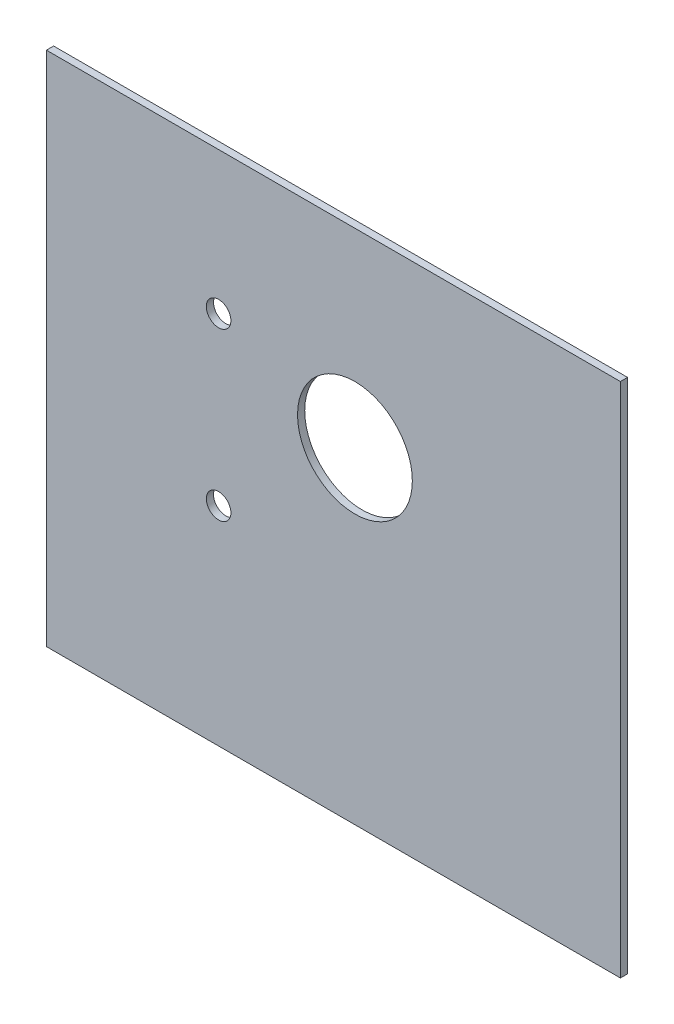
ISO-10303-21;
HEADER;
FILE_DESCRIPTION(('STEP AP214'),'2;1');
FILE_NAME('part.step','',(''),(''),'','','');
FILE_SCHEMA(('AUTOMOTIVE_DESIGN { 1 0 10303 214 1 1 1 1 }'));
ENDSEC;
DATA;
#1=APPLICATION_CONTEXT('core data for automotive mechanical design processes');
#2=APPLICATION_PROTOCOL_DEFINITION('international standard','automotive_design',2000,#1);
#3=PRODUCT_CONTEXT('',#1,'mechanical');
#4=PRODUCT('Part','Part','',(#3));
#5=PRODUCT_RELATED_PRODUCT_CATEGORY('part','',(#4));
#6=PRODUCT_DEFINITION_FORMATION('','',#4);
#7=PRODUCT_DEFINITION_CONTEXT('part definition',#1,'design');
#8=PRODUCT_DEFINITION('design','',#6,#7);
#9=PRODUCT_DEFINITION_SHAPE('','',#8);
#10=(LENGTH_UNIT() NAMED_UNIT(*) SI_UNIT(.MILLI.,.METRE.));
#11=(NAMED_UNIT(*) PLANE_ANGLE_UNIT() SI_UNIT($,.RADIAN.));
#12=(NAMED_UNIT(*) SI_UNIT($,.STERADIAN.) SOLID_ANGLE_UNIT());
#13=UNCERTAINTY_MEASURE_WITH_UNIT(LENGTH_MEASURE(1.E-05),#10,'distance_accuracy_value','');
#14=(GEOMETRIC_REPRESENTATION_CONTEXT(3) GLOBAL_UNCERTAINTY_ASSIGNED_CONTEXT((#13)) GLOBAL_UNIT_ASSIGNED_CONTEXT((#10,
#11,#12)) REPRESENTATION_CONTEXT('',''));
#15=CARTESIAN_POINT('',(0.,0.,0.));
#16=DIRECTION('',(0.,0.,1.));
#17=DIRECTION('',(1.,0.,0.));
#18=AXIS2_PLACEMENT_3D('',#15,#16,#17);
#19=CARTESIAN_POINT('',(200.,180.,5.));
#20=DIRECTION('',(-1.,0.,0.));
#21=DIRECTION('',(0.,-1.,0.));
#22=AXIS2_PLACEMENT_3D('',#19,#20,#21);
#23=PLANE('',#22);
#24=DIRECTION('',(0.,1.,0.));
#25=VECTOR('',#24,1.);
#26=CARTESIAN_POINT('',(200.,180.,0.));
#27=LINE('',#26,#25);
#28=CARTESIAN_POINT('',(200.,-180.,0.));
#29=VERTEX_POINT('',#28);
#30=CARTESIAN_POINT('',(200.,180.,0.));
#31=VERTEX_POINT('',#30);
#32=EDGE_CURVE('E101',#29,#31,#27,.T.);
#33=ORIENTED_EDGE('',*,*,#32,.T.);
#34=DIRECTION('',(0.,0.,-1.));
#35=VECTOR('',#34,1.);
#36=CARTESIAN_POINT('',(200.,180.,5.));
#37=LINE('',#36,#35);
#38=CARTESIAN_POINT('',(200.,180.,5.));
#39=VERTEX_POINT('',#38);
#40=EDGE_CURVE('E11',#39,#31,#37,.T.);
#41=ORIENTED_EDGE('',*,*,#40,.F.);
#42=DIRECTION('',(0.,1.,0.));
#43=VECTOR('',#42,1.);
#44=CARTESIAN_POINT('',(200.,180.,5.));
#45=LINE('',#44,#43);
#46=CARTESIAN_POINT('',(200.,-180.,5.));
#47=VERTEX_POINT('',#46);
#48=EDGE_CURVE('E89',#47,#39,#45,.T.);
#49=ORIENTED_EDGE('',*,*,#48,.F.);
#50=DIRECTION('',(0.,0.,-1.));
#51=VECTOR('',#50,1.);
#52=CARTESIAN_POINT('',(200.,-180.,5.));
#53=LINE('',#52,#51);
#54=EDGE_CURVE('E97',#47,#29,#53,.T.);
#55=ORIENTED_EDGE('',*,*,#54,.T.);
#56=EDGE_LOOP('',(#33,#41,#49,#55));
#57=FACE_BOUND('',#56,.T.);
#58=ADVANCED_FACE('F38',(#57),#23,.F.);
#59=CARTESIAN_POINT('',(-200.,180.,5.));
#60=DIRECTION('',(0.,-1.,0.));
#61=DIRECTION('',(0.,0.,-1.));
#62=AXIS2_PLACEMENT_3D('',#59,#60,#61);
#63=PLANE('',#62);
#64=DIRECTION('',(-1.,0.,0.));
#65=VECTOR('',#64,1.);
#66=CARTESIAN_POINT('',(-200.,180.,0.));
#67=LINE('',#66,#65);
#68=CARTESIAN_POINT('',(-200.,180.,0.));
#69=VERTEX_POINT('',#68);
#70=EDGE_CURVE('E93',#31,#69,#67,.T.);
#71=ORIENTED_EDGE('',*,*,#70,.T.);
#72=DIRECTION('',(0.,0.,-1.));
#73=VECTOR('',#72,1.);
#74=CARTESIAN_POINT('',(-200.,180.,5.));
#75=LINE('',#74,#73);
#76=CARTESIAN_POINT('',(-200.,180.,5.));
#77=VERTEX_POINT('',#76);
#78=EDGE_CURVE('E46',#77,#69,#75,.T.);
#79=ORIENTED_EDGE('',*,*,#78,.F.);
#80=DIRECTION('',(-1.,0.,0.));
#81=VECTOR('',#80,1.);
#82=CARTESIAN_POINT('',(-200.,180.,5.));
#83=LINE('',#82,#81);
#84=EDGE_CURVE('E84',#39,#77,#83,.T.);
#85=ORIENTED_EDGE('',*,*,#84,.F.);
#86=ORIENTED_EDGE('',*,*,#40,.T.);
#87=EDGE_LOOP('',(#71,#79,#85,#86));
#88=FACE_BOUND('',#87,.T.);
#89=ADVANCED_FACE('F92',(#88),#63,.F.);
#90=CARTESIAN_POINT('',(-200.,180.,5.));
#91=DIRECTION('',(1.,0.,0.));
#92=DIRECTION('',(0.,1.,0.));
#93=AXIS2_PLACEMENT_3D('',#90,#91,#92);
#94=PLANE('',#93);
#95=DIRECTION('',(0.,-1.,0.));
#96=VECTOR('',#95,1.);
#97=CARTESIAN_POINT('',(-200.,180.,0.));
#98=LINE('',#97,#96);
#99=CARTESIAN_POINT('',(-200.,-180.,0.));
#100=VERTEX_POINT('',#99);
#101=EDGE_CURVE('E71',#69,#100,#98,.T.);
#102=ORIENTED_EDGE('',*,*,#101,.T.);
#103=DIRECTION('',(0.,0.,-1.));
#104=VECTOR('',#103,1.);
#105=CARTESIAN_POINT('',(-200.,-180.,5.));
#106=LINE('',#105,#104);
#107=CARTESIAN_POINT('',(-200.,-180.,5.));
#108=VERTEX_POINT('',#107);
#109=EDGE_CURVE('E94',#108,#100,#106,.T.);
#110=ORIENTED_EDGE('',*,*,#109,.F.);
#111=DIRECTION('',(0.,-1.,0.));
#112=VECTOR('',#111,1.);
#113=CARTESIAN_POINT('',(-200.,180.,5.));
#114=LINE('',#113,#112);
#115=EDGE_CURVE('E87',#77,#108,#114,.T.);
#116=ORIENTED_EDGE('',*,*,#115,.F.);
#117=ORIENTED_EDGE('',*,*,#78,.T.);
#118=EDGE_LOOP('',(#102,#110,#116,#117));
#119=FACE_BOUND('',#118,.T.);
#120=ADVANCED_FACE('F95',(#119),#94,.F.);
#121=CARTESIAN_POINT('',(-200.,-180.,5.));
#122=DIRECTION('',(0.,1.,0.));
#123=DIRECTION('',(0.,0.,1.));
#124=AXIS2_PLACEMENT_3D('',#121,#122,#123);
#125=PLANE('',#124);
#126=DIRECTION('',(1.,0.,0.));
#127=VECTOR('',#126,1.);
#128=CARTESIAN_POINT('',(-200.,-180.,0.));
#129=LINE('',#128,#127);
#130=EDGE_CURVE('E77',#100,#29,#129,.T.);
#131=ORIENTED_EDGE('',*,*,#130,.T.);
#132=ORIENTED_EDGE('',*,*,#54,.F.);
#133=DIRECTION('',(1.,0.,0.));
#134=VECTOR('',#133,1.);
#135=CARTESIAN_POINT('',(-200.,-180.,5.));
#136=LINE('',#135,#134);
#137=EDGE_CURVE('E54',#108,#47,#136,.T.);
#138=ORIENTED_EDGE('',*,*,#137,.F.);
#139=ORIENTED_EDGE('',*,*,#109,.T.);
#140=EDGE_LOOP('',(#131,#132,#138,#139));
#141=FACE_BOUND('',#140,.T.);
#142=ADVANCED_FACE('F109',(#141),#125,.F.);
#143=CARTESIAN_POINT('',(0.,0.,5.));
#144=DIRECTION('',(0.,0.,1.));
#145=DIRECTION('',(1.,0.,0.));
#146=AXIS2_PLACEMENT_3D('',#143,#144,#145);
#147=PLANE('',#146);
#148=CARTESIAN_POINT('',(15.,47.5,5.));
#149=DIRECTION('',(0.,0.,1.));
#150=DIRECTION('',(1.,0.,0.));
#151=AXIS2_PLACEMENT_3D('',#148,#149,#150);
#152=CIRCLE('',#151,40.);
#153=CARTESIAN_POINT('',(55.,47.5,5.));
#154=VERTEX_POINT('',#153);
#155=EDGE_CURVE('E124',#154,#154,#152,.T.);
#156=ORIENTED_EDGE('',*,*,#155,.F.);
#157=EDGE_LOOP('',(#156));
#158=FACE_BOUND('',#157,.T.);
#159=CARTESIAN_POINT('',(-80.0000000000001,81.,5.));
#160=DIRECTION('',(0.,0.,1.));
#161=DIRECTION('',(1.,0.,0.));
#162=AXIS2_PLACEMENT_3D('',#159,#160,#161);
#163=CIRCLE('',#162,8.55999999999999);
#164=CARTESIAN_POINT('',(-71.4400000000001,81.,5.));
#165=VERTEX_POINT('',#164);
#166=EDGE_CURVE('E104',#165,#165,#163,.T.);
#167=ORIENTED_EDGE('',*,*,#166,.F.);
#168=EDGE_LOOP('',(#167));
#169=FACE_BOUND('',#168,.T.);
#170=CARTESIAN_POINT('',(-80.0000000000001,-35.,5.));
#171=DIRECTION('',(0.,0.,1.));
#172=DIRECTION('',(1.,0.,0.));
#173=AXIS2_PLACEMENT_3D('',#170,#171,#172);
#174=CIRCLE('',#173,8.55999999999999);
#175=CARTESIAN_POINT('',(-71.4400000000001,-35.,5.));
#176=VERTEX_POINT('',#175);
#177=EDGE_CURVE('E117',#176,#176,#174,.T.);
#178=ORIENTED_EDGE('',*,*,#177,.F.);
#179=EDGE_LOOP('',(#178));
#180=FACE_BOUND('',#179,.T.);
#181=ORIENTED_EDGE('',*,*,#48,.T.);
#182=ORIENTED_EDGE('',*,*,#84,.T.);
#183=ORIENTED_EDGE('',*,*,#115,.T.);
#184=ORIENTED_EDGE('',*,*,#137,.T.);
#185=EDGE_LOOP('',(#181,#182,#183,#184));
#186=FACE_BOUND('',#185,.T.);
#187=ADVANCED_FACE('F85',(#158,#169,#180,#186),#147,.T.);
#188=CARTESIAN_POINT('',(0.,0.,0.));
#189=DIRECTION('',(0.,0.,1.));
#190=DIRECTION('',(1.,0.,0.));
#191=AXIS2_PLACEMENT_3D('',#188,#189,#190);
#192=PLANE('',#191);
#193=CARTESIAN_POINT('',(15.,47.5,0.));
#194=DIRECTION('',(0.,0.,-1.));
#195=DIRECTION('',(-1.,0.,0.));
#196=AXIS2_PLACEMENT_3D('',#193,#194,#195);
#197=CIRCLE('',#196,40.);
#198=CARTESIAN_POINT('',(-25.,47.5,0.));
#199=VERTEX_POINT('',#198);
#200=EDGE_CURVE('E129',#199,#199,#197,.T.);
#201=ORIENTED_EDGE('',*,*,#200,.F.);
#202=EDGE_LOOP('',(#201));
#203=FACE_BOUND('',#202,.T.);
#204=CARTESIAN_POINT('',(-80.0000000000001,81.,0.));
#205=DIRECTION('',(0.,0.,-1.));
#206=DIRECTION('',(-1.,0.,0.));
#207=AXIS2_PLACEMENT_3D('',#204,#205,#206);
#208=CIRCLE('',#207,8.55999999999999);
#209=CARTESIAN_POINT('',(-88.5600000000001,81.,0.));
#210=VERTEX_POINT('',#209);
#211=EDGE_CURVE('E120',#210,#210,#208,.T.);
#212=ORIENTED_EDGE('',*,*,#211,.F.);
#213=EDGE_LOOP('',(#212));
#214=FACE_BOUND('',#213,.T.);
#215=CARTESIAN_POINT('',(-80.0000000000001,-35.,0.));
#216=DIRECTION('',(0.,0.,-1.));
#217=DIRECTION('',(-1.,0.,0.));
#218=AXIS2_PLACEMENT_3D('',#215,#216,#217);
#219=CIRCLE('',#218,8.55999999999999);
#220=CARTESIAN_POINT('',(-88.5600000000001,-35.,0.));
#221=VERTEX_POINT('',#220);
#222=EDGE_CURVE('E121',#221,#221,#219,.T.);
#223=ORIENTED_EDGE('',*,*,#222,.F.);
#224=EDGE_LOOP('',(#223));
#225=FACE_BOUND('',#224,.T.);
#226=ORIENTED_EDGE('',*,*,#32,.F.);
#227=ORIENTED_EDGE('',*,*,#130,.F.);
#228=ORIENTED_EDGE('',*,*,#101,.F.);
#229=ORIENTED_EDGE('',*,*,#70,.F.);
#230=EDGE_LOOP('',(#226,#227,#228,#229));
#231=FACE_BOUND('',#230,.T.);
#232=ADVANCED_FACE('F112',(#203,#214,#225,#231),#192,.F.);
#233=CARTESIAN_POINT('',(-80.0000000000001,-35.,10.));
#234=DIRECTION('',(0.,0.,-1.));
#235=DIRECTION('',(-1.,0.,0.));
#236=AXIS2_PLACEMENT_3D('',#233,#234,#235);
#237=CYLINDRICAL_SURFACE('',#236,8.55999999999999);
#238=ORIENTED_EDGE('',*,*,#177,.T.);
#239=EDGE_LOOP('',(#238));
#240=FACE_BOUND('',#239,.T.);
#241=ORIENTED_EDGE('',*,*,#222,.T.);
#242=EDGE_LOOP('',(#241));
#243=FACE_BOUND('',#242,.T.);
#244=ADVANCED_FACE('F137',(#240,#243),#237,.F.);
#245=CARTESIAN_POINT('',(-80.0000000000001,81.,10.));
#246=DIRECTION('',(0.,0.,-1.));
#247=DIRECTION('',(-1.,0.,0.));
#248=AXIS2_PLACEMENT_3D('',#245,#246,#247);
#249=CYLINDRICAL_SURFACE('',#248,8.55999999999999);
#250=ORIENTED_EDGE('',*,*,#166,.T.);
#251=EDGE_LOOP('',(#250));
#252=FACE_BOUND('',#251,.T.);
#253=ORIENTED_EDGE('',*,*,#211,.T.);
#254=EDGE_LOOP('',(#253));
#255=FACE_BOUND('',#254,.T.);
#256=ADVANCED_FACE('F144',(#252,#255),#249,.F.);
#257=CARTESIAN_POINT('',(15.,47.5,10.));
#258=DIRECTION('',(0.,0.,-1.));
#259=DIRECTION('',(-1.,0.,0.));
#260=AXIS2_PLACEMENT_3D('',#257,#258,#259);
#261=CYLINDRICAL_SURFACE('',#260,40.);
#262=ORIENTED_EDGE('',*,*,#155,.T.);
#263=EDGE_LOOP('',(#262));
#264=FACE_BOUND('',#263,.T.);
#265=ORIENTED_EDGE('',*,*,#200,.T.);
#266=EDGE_LOOP('',(#265));
#267=FACE_BOUND('',#266,.T.);
#268=ADVANCED_FACE('F133',(#264,#267),#261,.F.);
#269=CLOSED_SHELL('',(#58,#89,#120,#142,#187,#232,#244,#256,#268));
#270=MANIFOLD_SOLID_BREP('B2',#269);
#271=ADVANCED_BREP_SHAPE_REPRESENTATION('',(#18,#270),#14);
#272=SHAPE_DEFINITION_REPRESENTATION(#9,#271);
ENDSEC;
END-ISO-10303-21;
